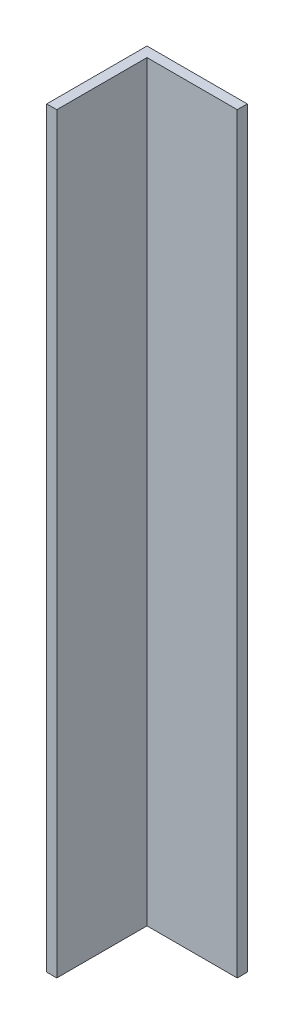
ISO-10303-21;
HEADER;
FILE_DESCRIPTION(('STEP AP214'),'2;1');
FILE_NAME('part.step','',(''),(''),'','','');
FILE_SCHEMA(('AUTOMOTIVE_DESIGN { 1 0 10303 214 1 1 1 1 }'));
ENDSEC;
DATA;
#1=APPLICATION_CONTEXT('core data for automotive mechanical design processes');
#2=APPLICATION_PROTOCOL_DEFINITION('international standard','automotive_design',2000,#1);
#3=PRODUCT_CONTEXT('',#1,'mechanical');
#4=PRODUCT('Part','Part','',(#3));
#5=PRODUCT_RELATED_PRODUCT_CATEGORY('part','',(#4));
#6=PRODUCT_DEFINITION_FORMATION('','',#4);
#7=PRODUCT_DEFINITION_CONTEXT('part definition',#1,'design');
#8=PRODUCT_DEFINITION('design','',#6,#7);
#9=PRODUCT_DEFINITION_SHAPE('','',#8);
#10=(LENGTH_UNIT() NAMED_UNIT(*) SI_UNIT(.MILLI.,.METRE.));
#11=(NAMED_UNIT(*) PLANE_ANGLE_UNIT() SI_UNIT($,.RADIAN.));
#12=(NAMED_UNIT(*) SI_UNIT($,.STERADIAN.) SOLID_ANGLE_UNIT());
#13=UNCERTAINTY_MEASURE_WITH_UNIT(LENGTH_MEASURE(1.E-05),#10,'distance_accuracy_value','');
#14=(GEOMETRIC_REPRESENTATION_CONTEXT(3) GLOBAL_UNCERTAINTY_ASSIGNED_CONTEXT((#13)) GLOBAL_UNIT_ASSIGNED_CONTEXT((#10,
#11,#12)) REPRESENTATION_CONTEXT('',''));
#15=CARTESIAN_POINT('',(0.,0.,0.));
#16=DIRECTION('',(0.,0.,1.));
#17=DIRECTION('',(1.,0.,0.));
#18=AXIS2_PLACEMENT_3D('',#15,#16,#17);
#19=CARTESIAN_POINT('',(-4.67162591994472,150.,-238.015372112767));
#20=DIRECTION('',(-1.,0.,0.));
#21=DIRECTION('',(0.,0.,1.));
#22=AXIS2_PLACEMENT_3D('',#19,#20,#21);
#23=PLANE('',#22);
#24=DIRECTION('',(0.,0.,-1.));
#25=VECTOR('',#24,1.);
#26=CARTESIAN_POINT('',(-4.67162591994472,0.,-238.015372112767));
#27=LINE('',#26,#25);
#28=CARTESIAN_POINT('',(-4.67162591994472,0.,-236.015372112767));
#29=VERTEX_POINT('',#28);
#30=CARTESIAN_POINT('',(-4.67162591994472,0.,-238.015372112767));
#31=VERTEX_POINT('',#30);
#32=EDGE_CURVE('E116',#29,#31,#27,.T.);
#33=ORIENTED_EDGE('',*,*,#32,.T.);
#34=DIRECTION('',(0.,-1.,0.));
#35=VECTOR('',#34,1.);
#36=CARTESIAN_POINT('',(-4.67162591994472,150.,-238.015372112767));
#37=LINE('',#36,#35);
#38=CARTESIAN_POINT('',(-4.67162591994472,150.,-238.015372112767));
#39=VERTEX_POINT('',#38);
#40=EDGE_CURVE('E11',#39,#31,#37,.T.);
#41=ORIENTED_EDGE('',*,*,#40,.F.);
#42=DIRECTION('',(0.,0.,-1.));
#43=VECTOR('',#42,1.);
#44=CARTESIAN_POINT('',(-4.67162591994472,150.,-238.015372112767));
#45=LINE('',#44,#43);
#46=CARTESIAN_POINT('',(-4.67162591994472,150.,-236.015372112767));
#47=VERTEX_POINT('',#46);
#48=EDGE_CURVE('E126',#47,#39,#45,.T.);
#49=ORIENTED_EDGE('',*,*,#48,.F.);
#50=DIRECTION('',(0.,-1.,0.));
#51=VECTOR('',#50,1.);
#52=CARTESIAN_POINT('',(-4.67162591994472,150.,-236.015372112767));
#53=LINE('',#52,#51);
#54=EDGE_CURVE('E112',#47,#29,#53,.T.);
#55=ORIENTED_EDGE('',*,*,#54,.T.);
#56=EDGE_LOOP('',(#33,#41,#49,#55));
#57=FACE_BOUND('',#56,.T.);
#58=ADVANCED_FACE('F32',(#57),#23,.F.);
#59=CARTESIAN_POINT('',(-4.67162591994472,150.,-238.015372112767));
#60=DIRECTION('',(0.,0.,1.));
#61=DIRECTION('',(1.,0.,0.));
#62=AXIS2_PLACEMENT_3D('',#59,#60,#61);
#63=PLANE('',#62);
#64=DIRECTION('',(-1.,0.,0.));
#65=VECTOR('',#64,1.);
#66=CARTESIAN_POINT('',(-4.67162591994472,0.,-238.015372112767));
#67=LINE('',#66,#65);
#68=CARTESIAN_POINT('',(-24.6716259199447,0.,-238.015372112767));
#69=VERTEX_POINT('',#68);
#70=EDGE_CURVE('E119',#31,#69,#67,.T.);
#71=ORIENTED_EDGE('',*,*,#70,.T.);
#72=DIRECTION('',(0.,-1.,0.));
#73=VECTOR('',#72,1.);
#74=CARTESIAN_POINT('',(-24.6716259199447,150.,-238.015372112767));
#75=LINE('',#74,#73);
#76=CARTESIAN_POINT('',(-24.6716259199447,150.,-238.015372112767));
#77=VERTEX_POINT('',#76);
#78=EDGE_CURVE('E40',#77,#69,#75,.T.);
#79=ORIENTED_EDGE('',*,*,#78,.F.);
#80=DIRECTION('',(-1.,0.,0.));
#81=VECTOR('',#80,1.);
#82=CARTESIAN_POINT('',(-4.67162591994472,150.,-238.015372112767));
#83=LINE('',#82,#81);
#84=EDGE_CURVE('E85',#39,#77,#83,.T.);
#85=ORIENTED_EDGE('',*,*,#84,.F.);
#86=ORIENTED_EDGE('',*,*,#40,.T.);
#87=EDGE_LOOP('',(#71,#79,#85,#86));
#88=FACE_BOUND('',#87,.T.);
#89=ADVANCED_FACE('F150',(#88),#63,.F.);
#90=CARTESIAN_POINT('',(-24.6716259199447,150.,-238.015372112767));
#91=DIRECTION('',(1.,0.,0.));
#92=DIRECTION('',(0.,0.,-1.));
#93=AXIS2_PLACEMENT_3D('',#90,#91,#92);
#94=PLANE('',#93);
#95=DIRECTION('',(0.,0.,1.));
#96=VECTOR('',#95,1.);
#97=CARTESIAN_POINT('',(-24.6716259199447,0.,-238.015372112767));
#98=LINE('',#97,#96);
#99=CARTESIAN_POINT('',(-24.6716259199447,0.,-218.015372112767));
#100=VERTEX_POINT('',#99);
#101=EDGE_CURVE('E121',#69,#100,#98,.T.);
#102=ORIENTED_EDGE('',*,*,#101,.T.);
#103=DIRECTION('',(0.,-1.,0.));
#104=VECTOR('',#103,1.);
#105=CARTESIAN_POINT('',(-24.6716259199447,150.,-218.015372112767));
#106=LINE('',#105,#104);
#107=CARTESIAN_POINT('',(-24.6716259199447,150.,-218.015372112767));
#108=VERTEX_POINT('',#107);
#109=EDGE_CURVE('E107',#108,#100,#106,.T.);
#110=ORIENTED_EDGE('',*,*,#109,.F.);
#111=DIRECTION('',(0.,0.,1.));
#112=VECTOR('',#111,1.);
#113=CARTESIAN_POINT('',(-24.6716259199447,150.,-238.015372112767));
#114=LINE('',#113,#112);
#115=EDGE_CURVE('E98',#77,#108,#114,.T.);
#116=ORIENTED_EDGE('',*,*,#115,.F.);
#117=ORIENTED_EDGE('',*,*,#78,.T.);
#118=EDGE_LOOP('',(#102,#110,#116,#117));
#119=FACE_BOUND('',#118,.T.);
#120=ADVANCED_FACE('F132',(#119),#94,.F.);
#121=CARTESIAN_POINT('',(-22.6716259199447,150.,-218.015372112767));
#122=DIRECTION('',(0.,0.,-1.));
#123=DIRECTION('',(-1.,0.,0.));
#124=AXIS2_PLACEMENT_3D('',#121,#122,#123);
#125=PLANE('',#124);
#126=DIRECTION('',(1.,0.,0.));
#127=VECTOR('',#126,1.);
#128=CARTESIAN_POINT('',(-22.6716259199447,0.,-218.015372112767));
#129=LINE('',#128,#127);
#130=CARTESIAN_POINT('',(-22.6716259199447,0.,-218.015372112767));
#131=VERTEX_POINT('',#130);
#132=EDGE_CURVE('E106',#100,#131,#129,.T.);
#133=ORIENTED_EDGE('',*,*,#132,.T.);
#134=DIRECTION('',(0.,-1.,0.));
#135=VECTOR('',#134,1.);
#136=CARTESIAN_POINT('',(-22.6716259199447,150.,-218.015372112767));
#137=LINE('',#136,#135);
#138=CARTESIAN_POINT('',(-22.6716259199447,150.,-218.015372112767));
#139=VERTEX_POINT('',#138);
#140=EDGE_CURVE('E103',#139,#131,#137,.T.);
#141=ORIENTED_EDGE('',*,*,#140,.F.);
#142=DIRECTION('',(1.,0.,0.));
#143=VECTOR('',#142,1.);
#144=CARTESIAN_POINT('',(-22.6716259199447,150.,-218.015372112767));
#145=LINE('',#144,#143);
#146=EDGE_CURVE('E92',#108,#139,#145,.T.);
#147=ORIENTED_EDGE('',*,*,#146,.F.);
#148=ORIENTED_EDGE('',*,*,#109,.T.);
#149=EDGE_LOOP('',(#133,#141,#147,#148));
#150=FACE_BOUND('',#149,.T.);
#151=ADVANCED_FACE('F104',(#150),#125,.F.);
#152=CARTESIAN_POINT('',(-22.6716259199447,150.,-236.015372112767));
#153=DIRECTION('',(-1.,0.,0.));
#154=DIRECTION('',(0.,0.,1.));
#155=AXIS2_PLACEMENT_3D('',#152,#153,#154);
#156=PLANE('',#155);
#157=DIRECTION('',(0.,0.,-1.));
#158=VECTOR('',#157,1.);
#159=CARTESIAN_POINT('',(-22.6716259199447,0.,-236.015372112767));
#160=LINE('',#159,#158);
#161=CARTESIAN_POINT('',(-22.6716259199447,0.,-236.015372112767));
#162=VERTEX_POINT('',#161);
#163=EDGE_CURVE('E71',#131,#162,#160,.T.);
#164=ORIENTED_EDGE('',*,*,#163,.T.);
#165=DIRECTION('',(0.,-1.,0.));
#166=VECTOR('',#165,1.);
#167=CARTESIAN_POINT('',(-22.6716259199447,150.,-236.015372112767));
#168=LINE('',#167,#166);
#169=CARTESIAN_POINT('',(-22.6716259199447,150.,-236.015372112767));
#170=VERTEX_POINT('',#169);
#171=EDGE_CURVE('E108',#170,#162,#168,.T.);
#172=ORIENTED_EDGE('',*,*,#171,.F.);
#173=DIRECTION('',(0.,0.,-1.));
#174=VECTOR('',#173,1.);
#175=CARTESIAN_POINT('',(-22.6716259199447,150.,-236.015372112767));
#176=LINE('',#175,#174);
#177=EDGE_CURVE('E96',#139,#170,#176,.T.);
#178=ORIENTED_EDGE('',*,*,#177,.F.);
#179=ORIENTED_EDGE('',*,*,#140,.T.);
#180=EDGE_LOOP('',(#164,#172,#178,#179));
#181=FACE_BOUND('',#180,.T.);
#182=ADVANCED_FACE('F110',(#181),#156,.F.);
#183=CARTESIAN_POINT('',(-4.67162591994472,150.,-236.015372112767));
#184=DIRECTION('',(0.,0.,-1.));
#185=DIRECTION('',(-1.,0.,0.));
#186=AXIS2_PLACEMENT_3D('',#183,#184,#185);
#187=PLANE('',#186);
#188=DIRECTION('',(1.,0.,0.));
#189=VECTOR('',#188,1.);
#190=CARTESIAN_POINT('',(-4.67162591994472,0.,-236.015372112767));
#191=LINE('',#190,#189);
#192=EDGE_CURVE('E77',#162,#29,#191,.T.);
#193=ORIENTED_EDGE('',*,*,#192,.T.);
#194=ORIENTED_EDGE('',*,*,#54,.F.);
#195=DIRECTION('',(1.,0.,0.));
#196=VECTOR('',#195,1.);
#197=CARTESIAN_POINT('',(-4.67162591994472,150.,-236.015372112767));
#198=LINE('',#197,#196);
#199=EDGE_CURVE('E48',#170,#47,#198,.T.);
#200=ORIENTED_EDGE('',*,*,#199,.F.);
#201=ORIENTED_EDGE('',*,*,#171,.T.);
#202=EDGE_LOOP('',(#193,#194,#200,#201));
#203=FACE_BOUND('',#202,.T.);
#204=ADVANCED_FACE('F139',(#203),#187,.F.);
#205=CARTESIAN_POINT('',(0.,150.,0.));
#206=DIRECTION('',(0.,-1.,0.));
#207=DIRECTION('',(0.,0.,-1.));
#208=AXIS2_PLACEMENT_3D('',#205,#206,#207);
#209=PLANE('',#208);
#210=ORIENTED_EDGE('',*,*,#48,.T.);
#211=ORIENTED_EDGE('',*,*,#84,.T.);
#212=ORIENTED_EDGE('',*,*,#115,.T.);
#213=ORIENTED_EDGE('',*,*,#146,.T.);
#214=ORIENTED_EDGE('',*,*,#177,.T.);
#215=ORIENTED_EDGE('',*,*,#199,.T.);
#216=EDGE_LOOP('',(#210,#211,#212,#213,#214,#215));
#217=FACE_BOUND('',#216,.T.);
#218=ADVANCED_FACE('F94',(#217),#209,.F.);
#219=CARTESIAN_POINT('',(0.,0.,0.));
#220=DIRECTION('',(0.,-1.,0.));
#221=DIRECTION('',(0.,0.,-1.));
#222=AXIS2_PLACEMENT_3D('',#219,#220,#221);
#223=PLANE('',#222);
#224=ORIENTED_EDGE('',*,*,#32,.F.);
#225=ORIENTED_EDGE('',*,*,#192,.F.);
#226=ORIENTED_EDGE('',*,*,#163,.F.);
#227=ORIENTED_EDGE('',*,*,#132,.F.);
#228=ORIENTED_EDGE('',*,*,#101,.F.);
#229=ORIENTED_EDGE('',*,*,#70,.F.);
#230=EDGE_LOOP('',(#224,#225,#226,#227,#228,#229));
#231=FACE_BOUND('',#230,.T.);
#232=ADVANCED_FACE('F135',(#231),#223,.T.);
#233=CLOSED_SHELL('',(#58,#89,#120,#151,#182,#204,#218,#232));
#234=MANIFOLD_SOLID_BREP('B2',#233);
#235=ADVANCED_BREP_SHAPE_REPRESENTATION('',(#18,#234),#14);
#236=SHAPE_DEFINITION_REPRESENTATION(#9,#235);
ENDSEC;
END-ISO-10303-21;
